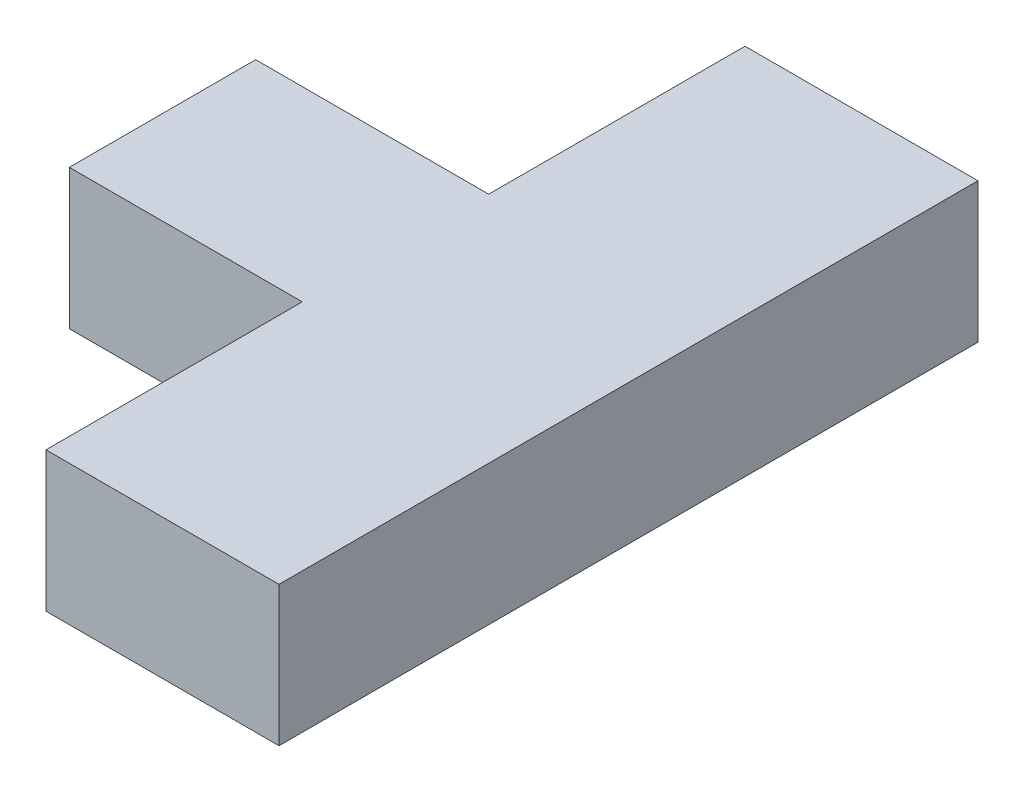
ISO-10303-21;
HEADER;
FILE_DESCRIPTION(('STEP AP214'),'2;1');
FILE_NAME('part.step','',(''),(''),'','','');
FILE_SCHEMA(('AUTOMOTIVE_DESIGN { 1 0 10303 214 1 1 1 1 }'));
ENDSEC;
DATA;
#1=APPLICATION_CONTEXT('core data for automotive mechanical design processes');
#2=APPLICATION_PROTOCOL_DEFINITION('international standard','automotive_design',2000,#1);
#3=PRODUCT_CONTEXT('',#1,'mechanical');
#4=PRODUCT('Part','Part','',(#3));
#5=PRODUCT_RELATED_PRODUCT_CATEGORY('part','',(#4));
#6=PRODUCT_DEFINITION_FORMATION('','',#4);
#7=PRODUCT_DEFINITION_CONTEXT('part definition',#1,'design');
#8=PRODUCT_DEFINITION('design','',#6,#7);
#9=PRODUCT_DEFINITION_SHAPE('','',#8);
#10=(LENGTH_UNIT() NAMED_UNIT(*) SI_UNIT(.MILLI.,.METRE.));
#11=(NAMED_UNIT(*) PLANE_ANGLE_UNIT() SI_UNIT($,.RADIAN.));
#12=(NAMED_UNIT(*) SI_UNIT($,.STERADIAN.) SOLID_ANGLE_UNIT());
#13=UNCERTAINTY_MEASURE_WITH_UNIT(LENGTH_MEASURE(1.E-05),#10,'distance_accuracy_value','');
#14=(GEOMETRIC_REPRESENTATION_CONTEXT(3) GLOBAL_UNCERTAINTY_ASSIGNED_CONTEXT((#13)) GLOBAL_UNIT_ASSIGNED_CONTEXT((#10,
#11,#12)) REPRESENTATION_CONTEXT('',''));
#15=CARTESIAN_POINT('',(0.,0.,0.));
#16=DIRECTION('',(0.,0.,1.));
#17=DIRECTION('',(1.,0.,0.));
#18=AXIS2_PLACEMENT_3D('',#15,#16,#17);
#19=CARTESIAN_POINT('',(0.,0.3,-1.49999999999998));
#20=DIRECTION('',(-1.,0.,0.));
#21=DIRECTION('',(0.,0.,1.));
#22=AXIS2_PLACEMENT_3D('',#19,#20,#21);
#23=PLANE('',#22);
#24=DIRECTION('',(0.,0.,-1.));
#25=VECTOR('',#24,1.);
#26=CARTESIAN_POINT('',(0.,0.,-1.49999999999998));
#27=LINE('',#26,#25);
#28=CARTESIAN_POINT('',(0.,0.,0.));
#29=VERTEX_POINT('',#28);
#30=CARTESIAN_POINT('',(0.,0.,-1.49999999999998));
#31=VERTEX_POINT('',#30);
#32=EDGE_CURVE('E155',#29,#31,#27,.T.);
#33=ORIENTED_EDGE('',*,*,#32,.T.);
#34=DIRECTION('',(0.,-1.,0.));
#35=VECTOR('',#34,1.);
#36=CARTESIAN_POINT('',(0.,0.3,-1.49999999999998));
#37=LINE('',#36,#35);
#38=CARTESIAN_POINT('',(0.,0.3,-1.49999999999998));
#39=VERTEX_POINT('',#38);
#40=EDGE_CURVE('E11',#39,#31,#37,.T.);
#41=ORIENTED_EDGE('',*,*,#40,.F.);
#42=DIRECTION('',(0.,0.,-1.));
#43=VECTOR('',#42,1.);
#44=CARTESIAN_POINT('',(0.,0.3,-1.49999999999998));
#45=LINE('',#44,#43);
#46=CARTESIAN_POINT('',(0.,0.3,0.));
#47=VERTEX_POINT('',#46);
#48=EDGE_CURVE('E177',#47,#39,#45,.T.);
#49=ORIENTED_EDGE('',*,*,#48,.F.);
#50=DIRECTION('',(0.,-1.,0.));
#51=VECTOR('',#50,1.);
#52=CARTESIAN_POINT('',(0.,0.3,0.));
#53=LINE('',#52,#51);
#54=EDGE_CURVE('E151',#47,#29,#53,.T.);
#55=ORIENTED_EDGE('',*,*,#54,.T.);
#56=EDGE_LOOP('',(#33,#41,#49,#55));
#57=FACE_BOUND('',#56,.T.);
#58=ADVANCED_FACE('F39',(#57),#23,.F.);
#59=CARTESIAN_POINT('',(0.,0.3,-1.49999999999998));
#60=DIRECTION('',(0.,0.,1.));
#61=DIRECTION('',(1.,0.,0.));
#62=AXIS2_PLACEMENT_3D('',#59,#60,#61);
#63=PLANE('',#62);
#64=DIRECTION('',(-1.,0.,0.));
#65=VECTOR('',#64,1.);
#66=CARTESIAN_POINT('',(0.,0.,-1.49999999999998));
#67=LINE('',#66,#65);
#68=CARTESIAN_POINT('',(-0.5,0.,-1.49999999999998));
#69=VERTEX_POINT('',#68);
#70=EDGE_CURVE('E159',#31,#69,#67,.T.);
#71=ORIENTED_EDGE('',*,*,#70,.T.);
#72=DIRECTION('',(0.,-1.,0.));
#73=VECTOR('',#72,1.);
#74=CARTESIAN_POINT('',(-0.5,0.3,-1.49999999999998));
#75=LINE('',#74,#73);
#76=CARTESIAN_POINT('',(-0.5,0.3,-1.49999999999998));
#77=VERTEX_POINT('',#76);
#78=EDGE_CURVE('E48',#77,#69,#75,.T.);
#79=ORIENTED_EDGE('',*,*,#78,.F.);
#80=DIRECTION('',(-1.,0.,0.));
#81=VECTOR('',#80,1.);
#82=CARTESIAN_POINT('',(0.,0.3,-1.49999999999998));
#83=LINE('',#82,#81);
#84=EDGE_CURVE('E109',#39,#77,#83,.T.);
#85=ORIENTED_EDGE('',*,*,#84,.F.);
#86=ORIENTED_EDGE('',*,*,#40,.T.);
#87=EDGE_LOOP('',(#71,#79,#85,#86));
#88=FACE_BOUND('',#87,.T.);
#89=ADVANCED_FACE('F221',(#88),#63,.F.);
#90=CARTESIAN_POINT('',(-0.5,0.3,-1.49999999999998));
#91=DIRECTION('',(1.,0.,0.));
#92=DIRECTION('',(0.,0.,-1.));
#93=AXIS2_PLACEMENT_3D('',#90,#91,#92);
#94=PLANE('',#93);
#95=DIRECTION('',(0.,0.,1.));
#96=VECTOR('',#95,1.);
#97=CARTESIAN_POINT('',(-0.5,0.,-1.49999999999998));
#98=LINE('',#97,#96);
#99=CARTESIAN_POINT('',(-0.5,0.,-0.949999999999992));
#100=VERTEX_POINT('',#99);
#101=EDGE_CURVE('E162',#69,#100,#98,.T.);
#102=ORIENTED_EDGE('',*,*,#101,.T.);
#103=DIRECTION('',(0.,-1.,0.));
#104=VECTOR('',#103,1.);
#105=CARTESIAN_POINT('',(-0.5,0.3,-0.949999999999992));
#106=LINE('',#105,#104);
#107=CARTESIAN_POINT('',(-0.5,0.3,-0.949999999999992));
#108=VERTEX_POINT('',#107);
#109=EDGE_CURVE('E187',#108,#100,#106,.T.);
#110=ORIENTED_EDGE('',*,*,#109,.F.);
#111=DIRECTION('',(0.,0.,1.));
#112=VECTOR('',#111,1.);
#113=CARTESIAN_POINT('',(-0.5,0.3,-1.49999999999998));
#114=LINE('',#113,#112);
#115=EDGE_CURVE('E197',#77,#108,#114,.T.);
#116=ORIENTED_EDGE('',*,*,#115,.F.);
#117=ORIENTED_EDGE('',*,*,#78,.T.);
#118=EDGE_LOOP('',(#102,#110,#116,#117));
#119=FACE_BOUND('',#118,.T.);
#120=ADVANCED_FACE('F195',(#119),#94,.F.);
#121=CARTESIAN_POINT('',(-0.5,0.3,-0.949999999999992));
#122=DIRECTION('',(0.,0.,1.));
#123=DIRECTION('',(1.,0.,0.));
#124=AXIS2_PLACEMENT_3D('',#121,#122,#123);
#125=PLANE('',#124);
#126=DIRECTION('',(-1.,0.,0.));
#127=VECTOR('',#126,1.);
#128=CARTESIAN_POINT('',(-0.5,0.,-0.949999999999992));
#129=LINE('',#128,#127);
#130=CARTESIAN_POINT('',(-1.,0.,-0.949999999999992));
#131=VERTEX_POINT('',#130);
#132=EDGE_CURVE('E165',#100,#131,#129,.T.);
#133=ORIENTED_EDGE('',*,*,#132,.T.);
#134=DIRECTION('',(0.,-1.,0.));
#135=VECTOR('',#134,1.);
#136=CARTESIAN_POINT('',(-1.,0.3,-0.949999999999992));
#137=LINE('',#136,#135);
#138=CARTESIAN_POINT('',(-1.,0.3,-0.949999999999992));
#139=VERTEX_POINT('',#138);
#140=EDGE_CURVE('E183',#139,#131,#137,.T.);
#141=ORIENTED_EDGE('',*,*,#140,.F.);
#142=DIRECTION('',(-1.,0.,0.));
#143=VECTOR('',#142,1.);
#144=CARTESIAN_POINT('',(-0.5,0.3,-0.949999999999992));
#145=LINE('',#144,#143);
#146=EDGE_CURVE('E210',#108,#139,#145,.T.);
#147=ORIENTED_EDGE('',*,*,#146,.F.);
#148=ORIENTED_EDGE('',*,*,#109,.T.);
#149=EDGE_LOOP('',(#133,#141,#147,#148));
#150=FACE_BOUND('',#149,.T.);
#151=ADVANCED_FACE('F205',(#150),#125,.F.);
#152=CARTESIAN_POINT('',(-1.,0.3,-0.949999999999992));
#153=DIRECTION('',(1.,0.,0.));
#154=DIRECTION('',(0.,0.,-1.));
#155=AXIS2_PLACEMENT_3D('',#152,#153,#154);
#156=PLANE('',#155);
#157=DIRECTION('',(0.,0.,1.));
#158=VECTOR('',#157,1.);
#159=CARTESIAN_POINT('',(-1.,0.,-0.949999999999992));
#160=LINE('',#159,#158);
#161=CARTESIAN_POINT('',(-1.,0.,-0.549999999999992));
#162=VERTEX_POINT('',#161);
#163=EDGE_CURVE('E168',#131,#162,#160,.T.);
#164=ORIENTED_EDGE('',*,*,#163,.T.);
#165=DIRECTION('',(0.,-1.,0.));
#166=VECTOR('',#165,1.);
#167=CARTESIAN_POINT('',(-1.,0.3,-0.549999999999992));
#168=LINE('',#167,#166);
#169=CARTESIAN_POINT('',(-1.,0.3,-0.549999999999992));
#170=VERTEX_POINT('',#169);
#171=EDGE_CURVE('E143',#170,#162,#168,.T.);
#172=ORIENTED_EDGE('',*,*,#171,.F.);
#173=DIRECTION('',(0.,0.,1.));
#174=VECTOR('',#173,1.);
#175=CARTESIAN_POINT('',(-1.,0.3,-0.949999999999992));
#176=LINE('',#175,#174);
#177=EDGE_CURVE('E132',#139,#170,#176,.T.);
#178=ORIENTED_EDGE('',*,*,#177,.F.);
#179=ORIENTED_EDGE('',*,*,#140,.T.);
#180=EDGE_LOOP('',(#164,#172,#178,#179));
#181=FACE_BOUND('',#180,.T.);
#182=ADVANCED_FACE('F208',(#181),#156,.F.);
#183=CARTESIAN_POINT('',(-1.,0.3,-0.549999999999992));
#184=DIRECTION('',(0.,0.,-1.));
#185=DIRECTION('',(-1.,0.,0.));
#186=AXIS2_PLACEMENT_3D('',#183,#184,#185);
#187=PLANE('',#186);
#188=DIRECTION('',(1.,0.,0.));
#189=VECTOR('',#188,1.);
#190=CARTESIAN_POINT('',(-1.,0.,-0.549999999999992));
#191=LINE('',#190,#189);
#192=CARTESIAN_POINT('',(-0.5,0.,-0.549999999999992));
#193=VERTEX_POINT('',#192);
#194=EDGE_CURVE('E141',#162,#193,#191,.T.);
#195=ORIENTED_EDGE('',*,*,#194,.T.);
#196=DIRECTION('',(0.,-1.,0.));
#197=VECTOR('',#196,1.);
#198=CARTESIAN_POINT('',(-0.5,0.3,-0.549999999999992));
#199=LINE('',#198,#197);
#200=CARTESIAN_POINT('',(-0.5,0.3,-0.549999999999992));
#201=VERTEX_POINT('',#200);
#202=EDGE_CURVE('E138',#201,#193,#199,.T.);
#203=ORIENTED_EDGE('',*,*,#202,.F.);
#204=DIRECTION('',(1.,0.,0.));
#205=VECTOR('',#204,1.);
#206=CARTESIAN_POINT('',(-1.,0.3,-0.549999999999992));
#207=LINE('',#206,#205);
#208=EDGE_CURVE('E126',#170,#201,#207,.T.);
#209=ORIENTED_EDGE('',*,*,#208,.F.);
#210=ORIENTED_EDGE('',*,*,#171,.T.);
#211=EDGE_LOOP('',(#195,#203,#209,#210));
#212=FACE_BOUND('',#211,.T.);
#213=ADVANCED_FACE('F139',(#212),#187,.F.);
#214=CARTESIAN_POINT('',(-0.5,0.3,-0.549999999999992));
#215=DIRECTION('',(1.,0.,0.));
#216=DIRECTION('',(0.,0.,-1.));
#217=AXIS2_PLACEMENT_3D('',#214,#215,#216);
#218=PLANE('',#217);
#219=DIRECTION('',(0.,0.,1.));
#220=VECTOR('',#219,1.);
#221=CARTESIAN_POINT('',(-0.5,0.,-0.549999999999992));
#222=LINE('',#221,#220);
#223=CARTESIAN_POINT('',(-0.5,0.,0.));
#224=VERTEX_POINT('',#223);
#225=EDGE_CURVE('E94',#193,#224,#222,.T.);
#226=ORIENTED_EDGE('',*,*,#225,.T.);
#227=DIRECTION('',(0.,-1.,0.));
#228=VECTOR('',#227,1.);
#229=CARTESIAN_POINT('',(-0.5,0.3,0.));
#230=LINE('',#229,#228);
#231=CARTESIAN_POINT('',(-0.5,0.3,0.));
#232=VERTEX_POINT('',#231);
#233=EDGE_CURVE('E144',#232,#224,#230,.T.);
#234=ORIENTED_EDGE('',*,*,#233,.F.);
#235=DIRECTION('',(0.,0.,1.));
#236=VECTOR('',#235,1.);
#237=CARTESIAN_POINT('',(-0.5,0.3,-0.549999999999992));
#238=LINE('',#237,#236);
#239=EDGE_CURVE('E130',#201,#232,#238,.T.);
#240=ORIENTED_EDGE('',*,*,#239,.F.);
#241=ORIENTED_EDGE('',*,*,#202,.T.);
#242=EDGE_LOOP('',(#226,#234,#240,#241));
#243=FACE_BOUND('',#242,.T.);
#244=ADVANCED_FACE('F146',(#243),#218,.F.);
#245=CARTESIAN_POINT('',(-0.5,0.3,0.));
#246=DIRECTION('',(0.,0.,-1.));
#247=DIRECTION('',(-1.,0.,0.));
#248=AXIS2_PLACEMENT_3D('',#245,#246,#247);
#249=PLANE('',#248);
#250=DIRECTION('',(1.,0.,0.));
#251=VECTOR('',#250,1.);
#252=CARTESIAN_POINT('',(-0.5,0.,0.));
#253=LINE('',#252,#251);
#254=EDGE_CURVE('E100',#224,#29,#253,.T.);
#255=ORIENTED_EDGE('',*,*,#254,.T.);
#256=ORIENTED_EDGE('',*,*,#54,.F.);
#257=DIRECTION('',(1.,0.,0.));
#258=VECTOR('',#257,1.);
#259=CARTESIAN_POINT('',(-0.5,0.3,0.));
#260=LINE('',#259,#258);
#261=EDGE_CURVE('E56',#232,#47,#260,.T.);
#262=ORIENTED_EDGE('',*,*,#261,.F.);
#263=ORIENTED_EDGE('',*,*,#233,.T.);
#264=EDGE_LOOP('',(#255,#256,#262,#263));
#265=FACE_BOUND('',#264,.T.);
#266=ADVANCED_FACE('F237',(#265),#249,.F.);
#267=CARTESIAN_POINT('',(0.,0.3,0.));
#268=DIRECTION('',(0.,1.,0.));
#269=DIRECTION('',(0.,0.,1.));
#270=AXIS2_PLACEMENT_3D('',#267,#268,#269);
#271=PLANE('',#270);
#272=ORIENTED_EDGE('',*,*,#48,.T.);
#273=ORIENTED_EDGE('',*,*,#84,.T.);
#274=ORIENTED_EDGE('',*,*,#115,.T.);
#275=ORIENTED_EDGE('',*,*,#146,.T.);
#276=ORIENTED_EDGE('',*,*,#177,.T.);
#277=ORIENTED_EDGE('',*,*,#208,.T.);
#278=ORIENTED_EDGE('',*,*,#239,.T.);
#279=ORIENTED_EDGE('',*,*,#261,.T.);
#280=EDGE_LOOP('',(#272,#273,#274,#275,#276,#277,#278,#279));
#281=FACE_BOUND('',#280,.T.);
#282=ADVANCED_FACE('F128',(#281),#271,.T.);
#283=CARTESIAN_POINT('',(0.,0.,0.));
#284=DIRECTION('',(0.,1.,0.));
#285=DIRECTION('',(0.,0.,1.));
#286=AXIS2_PLACEMENT_3D('',#283,#284,#285);
#287=PLANE('',#286);
#288=ORIENTED_EDGE('',*,*,#32,.F.);
#289=ORIENTED_EDGE('',*,*,#254,.F.);
#290=ORIENTED_EDGE('',*,*,#225,.F.);
#291=ORIENTED_EDGE('',*,*,#194,.F.);
#292=ORIENTED_EDGE('',*,*,#163,.F.);
#293=ORIENTED_EDGE('',*,*,#132,.F.);
#294=ORIENTED_EDGE('',*,*,#101,.F.);
#295=ORIENTED_EDGE('',*,*,#70,.F.);
#296=EDGE_LOOP('',(#288,#289,#290,#291,#292,#293,#294,#295));
#297=FACE_BOUND('',#296,.T.);
#298=ADVANCED_FACE('F201',(#297),#287,.F.);
#299=CLOSED_SHELL('',(#58,#89,#120,#151,#182,#213,#244,#266,#282,#298));
#300=MANIFOLD_SOLID_BREP('B2',#299);
#301=ADVANCED_BREP_SHAPE_REPRESENTATION('',(#18,#300),#14);
#302=SHAPE_DEFINITION_REPRESENTATION(#9,#301);
ENDSEC;
END-ISO-10303-21;
